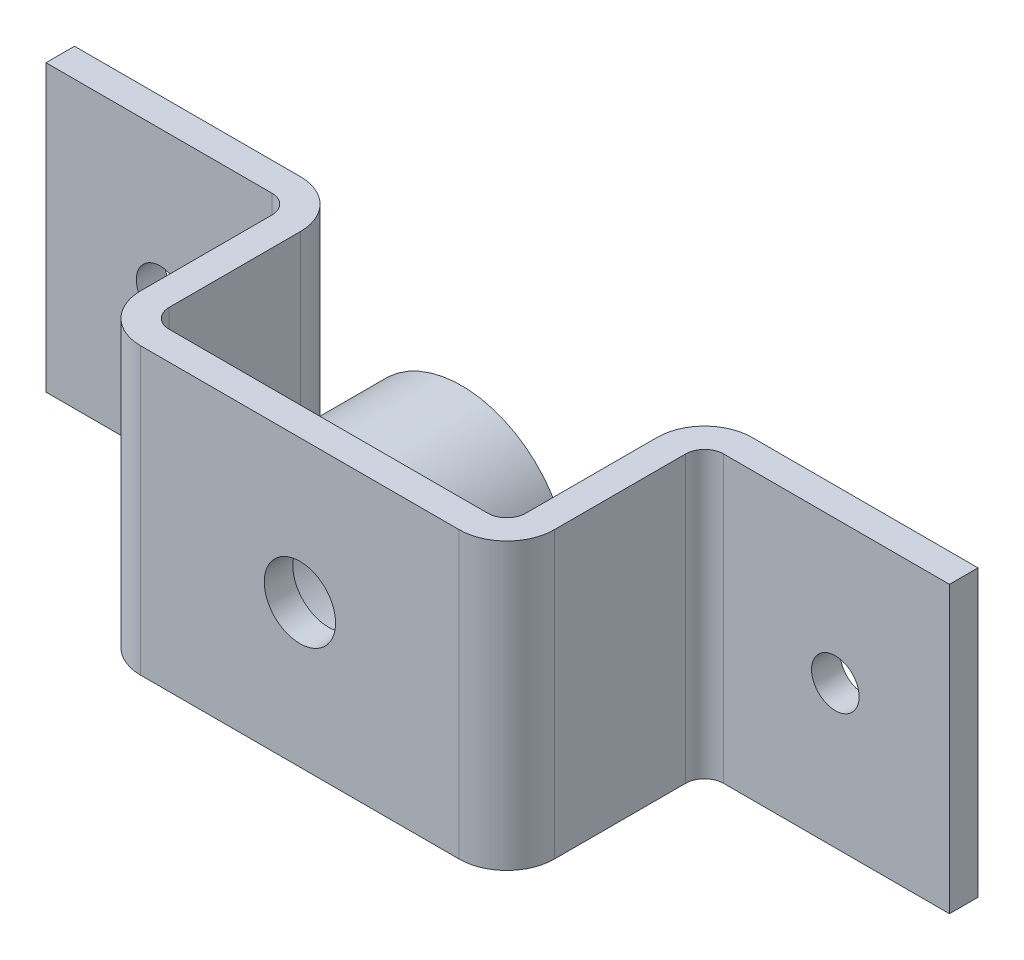
ISO-10303-21;
HEADER;
FILE_DESCRIPTION(('STEP AP214'),'2;1');
FILE_NAME('part.step','',(''),(''),'','','');
FILE_SCHEMA(('AUTOMOTIVE_DESIGN { 1 0 10303 214 1 1 1 1 }'));
ENDSEC;
DATA;
#1=APPLICATION_CONTEXT('core data for automotive mechanical design processes');
#2=APPLICATION_PROTOCOL_DEFINITION('international standard','automotive_design',2000,#1);
#3=PRODUCT_CONTEXT('',#1,'mechanical');
#4=PRODUCT('Part','Part','',(#3));
#5=PRODUCT_RELATED_PRODUCT_CATEGORY('part','',(#4));
#6=PRODUCT_DEFINITION_FORMATION('','',#4);
#7=PRODUCT_DEFINITION_CONTEXT('part definition',#1,'design');
#8=PRODUCT_DEFINITION('design','',#6,#7);
#9=PRODUCT_DEFINITION_SHAPE('','',#8);
#10=(LENGTH_UNIT() NAMED_UNIT(*) SI_UNIT(.MILLI.,.METRE.));
#11=(NAMED_UNIT(*) PLANE_ANGLE_UNIT() SI_UNIT($,.RADIAN.));
#12=(NAMED_UNIT(*) SI_UNIT($,.STERADIAN.) SOLID_ANGLE_UNIT());
#13=UNCERTAINTY_MEASURE_WITH_UNIT(LENGTH_MEASURE(1.E-05),#10,'distance_accuracy_value','');
#14=(GEOMETRIC_REPRESENTATION_CONTEXT(3) GLOBAL_UNCERTAINTY_ASSIGNED_CONTEXT((#13)) GLOBAL_UNIT_ASSIGNED_CONTEXT((#10,
#11,#12)) REPRESENTATION_CONTEXT('',''));
#15=CARTESIAN_POINT('',(0.,0.,0.));
#16=DIRECTION('',(0.,0.,1.));
#17=DIRECTION('',(1.,0.,0.));
#18=AXIS2_PLACEMENT_3D('',#15,#16,#17);
#19=CARTESIAN_POINT('',(-475.,300.,0.));
#20=DIRECTION('',(1.,0.,0.));
#21=DIRECTION('',(0.,0.,-1.));
#22=AXIS2_PLACEMENT_3D('',#19,#20,#21);
#23=PLANE('',#22);
#24=DIRECTION('',(0.,0.,1.));
#25=VECTOR('',#24,1.);
#26=CARTESIAN_POINT('',(-475.,0.,0.));
#27=LINE('',#26,#25);
#28=CARTESIAN_POINT('',(-475.,0.,0.));
#29=VERTEX_POINT('',#28);
#30=CARTESIAN_POINT('',(-475.,0.,30.));
#31=VERTEX_POINT('',#30);
#32=EDGE_CURVE('E207',#29,#31,#27,.T.);
#33=ORIENTED_EDGE('',*,*,#32,.T.);
#34=DIRECTION('',(0.,-1.,0.));
#35=VECTOR('',#34,1.);
#36=CARTESIAN_POINT('',(-475.,300.,30.));
#37=LINE('',#36,#35);
#38=CARTESIAN_POINT('',(-475.,300.,30.));
#39=VERTEX_POINT('',#38);
#40=EDGE_CURVE('E46',#39,#31,#37,.T.);
#41=ORIENTED_EDGE('',*,*,#40,.F.);
#42=DIRECTION('',(0.,0.,1.));
#43=VECTOR('',#42,1.);
#44=CARTESIAN_POINT('',(-475.,300.,0.));
#45=LINE('',#44,#43);
#46=CARTESIAN_POINT('',(-475.,300.,0.));
#47=VERTEX_POINT('',#46);
#48=EDGE_CURVE('E246',#47,#39,#45,.T.);
#49=ORIENTED_EDGE('',*,*,#48,.F.);
#50=DIRECTION('',(0.,-1.,0.));
#51=VECTOR('',#50,1.);
#52=CARTESIAN_POINT('',(-475.,300.,0.));
#53=LINE('',#52,#51);
#54=EDGE_CURVE('E203',#47,#29,#53,.T.);
#55=ORIENTED_EDGE('',*,*,#54,.T.);
#56=EDGE_LOOP('',(#33,#41,#49,#55));
#57=FACE_BOUND('',#56,.T.);
#58=ADVANCED_FACE('F37',(#57),#23,.F.);
#59=CARTESIAN_POINT('',(-475.,300.,30.));
#60=DIRECTION('',(0.,0.,-1.));
#61=DIRECTION('',(-1.,0.,0.));
#62=AXIS2_PLACEMENT_3D('',#59,#60,#61);
#63=PLANE('',#62);
#64=CARTESIAN_POINT('',(-355.,150.,30.));
#65=DIRECTION('',(0.,0.,-1.));
#66=DIRECTION('',(-1.,0.,0.));
#67=AXIS2_PLACEMENT_3D('',#64,#65,#66);
#68=CIRCLE('',#67,25.);
#69=CARTESIAN_POINT('',(-380.,150.,30.));
#70=VERTEX_POINT('',#69);
#71=EDGE_CURVE('E424',#70,#70,#68,.T.);
#72=ORIENTED_EDGE('',*,*,#71,.T.);
#73=EDGE_LOOP('',(#72));
#74=FACE_BOUND('',#73,.T.);
#75=DIRECTION('',(1.,0.,0.));
#76=VECTOR('',#75,1.);
#77=CARTESIAN_POINT('',(-475.,0.,30.));
#78=LINE('',#77,#76);
#79=CARTESIAN_POINT('',(-237.5,0.,30.));
#80=VERTEX_POINT('',#79);
#81=EDGE_CURVE('E210',#31,#80,#78,.T.);
#82=ORIENTED_EDGE('',*,*,#81,.T.);
#83=DIRECTION('',(0.,-1.,0.));
#84=VECTOR('',#83,1.);
#85=CARTESIAN_POINT('',(-237.5,300.,30.));
#86=LINE('',#85,#84);
#87=CARTESIAN_POINT('',(-237.5,300.,30.));
#88=VERTEX_POINT('',#87);
#89=EDGE_CURVE('E292',#88,#80,#86,.T.);
#90=ORIENTED_EDGE('',*,*,#89,.F.);
#91=DIRECTION('',(1.,0.,0.));
#92=VECTOR('',#91,1.);
#93=CARTESIAN_POINT('',(-475.,300.,30.));
#94=LINE('',#93,#92);
#95=EDGE_CURVE('E134',#39,#88,#94,.T.);
#96=ORIENTED_EDGE('',*,*,#95,.F.);
#97=ORIENTED_EDGE('',*,*,#40,.T.);
#98=EDGE_LOOP('',(#82,#90,#96,#97));
#99=FACE_BOUND('',#98,.T.);
#100=ADVANCED_FACE('F296',(#74,#99),#63,.F.);
#101=CARTESIAN_POINT('',(-237.5,300.,50.));
#102=DIRECTION('',(0.,-1.,0.));
#103=DIRECTION('',(0.,0.,-1.));
#104=AXIS2_PLACEMENT_3D('',#101,#102,#103);
#105=CYLINDRICAL_SURFACE('',#104,20.);
#106=CARTESIAN_POINT('',(-237.5,0.,50.));
#107=DIRECTION('',(0.,-1.,0.));
#108=DIRECTION('',(0.,0.,1.));
#109=AXIS2_PLACEMENT_3D('',#106,#107,#108);
#110=CIRCLE('',#109,20.);
#111=CARTESIAN_POINT('',(-217.5,0.,50.0000000000001));
#112=VERTEX_POINT('',#111);
#113=EDGE_CURVE('E213',#80,#112,#110,.T.);
#114=ORIENTED_EDGE('',*,*,#113,.T.);
#115=DIRECTION('',(0.,-1.,0.));
#116=VECTOR('',#115,1.);
#117=CARTESIAN_POINT('',(-217.5,300.,50.0000000000001));
#118=LINE('',#117,#116);
#119=CARTESIAN_POINT('',(-217.5,300.,50.0000000000001));
#120=VERTEX_POINT('',#119);
#121=EDGE_CURVE('E289',#120,#112,#118,.T.);
#122=ORIENTED_EDGE('',*,*,#121,.F.);
#123=CARTESIAN_POINT('',(-237.5,300.,50.));
#124=DIRECTION('',(0.,-1.,0.));
#125=DIRECTION('',(0.,0.,1.));
#126=AXIS2_PLACEMENT_3D('',#123,#124,#125);
#127=CIRCLE('',#126,20.);
#128=EDGE_CURVE('E316',#88,#120,#127,.T.);
#129=ORIENTED_EDGE('',*,*,#128,.F.);
#130=ORIENTED_EDGE('',*,*,#89,.T.);
#131=EDGE_LOOP('',(#114,#122,#129,#130));
#132=FACE_BOUND('',#131,.T.);
#133=ADVANCED_FACE('F307',(#132),#105,.F.);
#134=CARTESIAN_POINT('',(-217.5,300.,188.));
#135=DIRECTION('',(1.,0.,0.));
#136=DIRECTION('',(0.,0.,-1.));
#137=AXIS2_PLACEMENT_3D('',#134,#135,#136);
#138=PLANE('',#137);
#139=DIRECTION('',(0.,0.,1.));
#140=VECTOR('',#139,1.);
#141=CARTESIAN_POINT('',(-217.5,0.,188.));
#142=LINE('',#141,#140);
#143=CARTESIAN_POINT('',(-217.5,0.,188.));
#144=VERTEX_POINT('',#143);
#145=EDGE_CURVE('E215',#112,#144,#142,.T.);
#146=ORIENTED_EDGE('',*,*,#145,.T.);
#147=DIRECTION('',(0.,-1.,0.));
#148=VECTOR('',#147,1.);
#149=CARTESIAN_POINT('',(-217.5,300.,188.));
#150=LINE('',#149,#148);
#151=CARTESIAN_POINT('',(-217.5,300.,188.));
#152=VERTEX_POINT('',#151);
#153=EDGE_CURVE('E286',#152,#144,#150,.T.);
#154=ORIENTED_EDGE('',*,*,#153,.F.);
#155=DIRECTION('',(0.,0.,1.));
#156=VECTOR('',#155,1.);
#157=CARTESIAN_POINT('',(-217.5,300.,188.));
#158=LINE('',#157,#156);
#159=EDGE_CURVE('E313',#120,#152,#158,.T.);
#160=ORIENTED_EDGE('',*,*,#159,.F.);
#161=ORIENTED_EDGE('',*,*,#121,.T.);
#162=EDGE_LOOP('',(#146,#154,#160,#161));
#163=FACE_BOUND('',#162,.T.);
#164=ADVANCED_FACE('F311',(#163),#138,.F.);
#165=CARTESIAN_POINT('',(-167.5,300.,188.));
#166=DIRECTION('',(0.,-1.,0.));
#167=DIRECTION('',(0.,0.,-1.));
#168=AXIS2_PLACEMENT_3D('',#165,#166,#167);
#169=CYLINDRICAL_SURFACE('',#168,50.);
#170=CARTESIAN_POINT('',(-167.5,0.,188.));
#171=DIRECTION('',(0.,1.,0.));
#172=DIRECTION('',(0.,0.,-1.));
#173=AXIS2_PLACEMENT_3D('',#170,#171,#172);
#174=CIRCLE('',#173,50.);
#175=CARTESIAN_POINT('',(-167.5,0.,238.));
#176=VERTEX_POINT('',#175);
#177=EDGE_CURVE('E217',#144,#176,#174,.T.);
#178=ORIENTED_EDGE('',*,*,#177,.T.);
#179=DIRECTION('',(0.,-1.,0.));
#180=VECTOR('',#179,1.);
#181=CARTESIAN_POINT('',(-167.5,300.,238.));
#182=LINE('',#181,#180);
#183=CARTESIAN_POINT('',(-167.5,300.,238.));
#184=VERTEX_POINT('',#183);
#185=EDGE_CURVE('E283',#184,#176,#182,.T.);
#186=ORIENTED_EDGE('',*,*,#185,.F.);
#187=CARTESIAN_POINT('',(-167.5,300.,188.));
#188=DIRECTION('',(0.,1.,0.));
#189=DIRECTION('',(0.,0.,-1.));
#190=AXIS2_PLACEMENT_3D('',#187,#188,#189);
#191=CIRCLE('',#190,50.);
#192=EDGE_CURVE('E315',#152,#184,#191,.T.);
#193=ORIENTED_EDGE('',*,*,#192,.F.);
#194=ORIENTED_EDGE('',*,*,#153,.T.);
#195=EDGE_LOOP('',(#178,#186,#193,#194));
#196=FACE_BOUND('',#195,.T.);
#197=ADVANCED_FACE('F403',(#196),#169,.T.);
#198=CARTESIAN_POINT('',(-167.5,300.,238.));
#199=DIRECTION('',(0.,0.,-1.));
#200=DIRECTION('',(-1.,0.,0.));
#201=AXIS2_PLACEMENT_3D('',#198,#199,#200);
#202=PLANE('',#201);
#203=CARTESIAN_POINT('',(0.,150.,238.));
#204=DIRECTION('',(0.,0.,-1.));
#205=DIRECTION('',(-1.,0.,0.));
#206=AXIS2_PLACEMENT_3D('',#203,#204,#205);
#207=CIRCLE('',#206,37.5);
#208=CARTESIAN_POINT('',(-37.5,150.,238.));
#209=VERTEX_POINT('',#208);
#210=EDGE_CURVE('E40',#209,#209,#207,.T.);
#211=ORIENTED_EDGE('',*,*,#210,.T.);
#212=EDGE_LOOP('',(#211));
#213=FACE_BOUND('',#212,.T.);
#214=DIRECTION('',(1.,0.,0.));
#215=VECTOR('',#214,1.);
#216=CARTESIAN_POINT('',(-167.5,0.,238.));
#217=LINE('',#216,#215);
#218=CARTESIAN_POINT('',(167.5,0.,238.));
#219=VERTEX_POINT('',#218);
#220=EDGE_CURVE('E219',#176,#219,#217,.T.);
#221=ORIENTED_EDGE('',*,*,#220,.T.);
#222=DIRECTION('',(0.,-1.,0.));
#223=VECTOR('',#222,1.);
#224=CARTESIAN_POINT('',(167.5,300.,238.));
#225=LINE('',#224,#223);
#226=CARTESIAN_POINT('',(167.5,300.,238.));
#227=VERTEX_POINT('',#226);
#228=EDGE_CURVE('E280',#227,#219,#225,.T.);
#229=ORIENTED_EDGE('',*,*,#228,.F.);
#230=DIRECTION('',(1.,0.,0.));
#231=VECTOR('',#230,1.);
#232=CARTESIAN_POINT('',(-167.5,300.,238.));
#233=LINE('',#232,#231);
#234=EDGE_CURVE('E318',#184,#227,#233,.T.);
#235=ORIENTED_EDGE('',*,*,#234,.F.);
#236=ORIENTED_EDGE('',*,*,#185,.T.);
#237=EDGE_LOOP('',(#221,#229,#235,#236));
#238=FACE_BOUND('',#237,.T.);
#239=ADVANCED_FACE('F399',(#213,#238),#202,.F.);
#240=CARTESIAN_POINT('',(167.5,300.,188.));
#241=DIRECTION('',(0.,-1.,0.));
#242=DIRECTION('',(0.,0.,-1.));
#243=AXIS2_PLACEMENT_3D('',#240,#241,#242);
#244=CYLINDRICAL_SURFACE('',#243,50.);
#245=CARTESIAN_POINT('',(167.5,0.,188.));
#246=DIRECTION('',(0.,1.,0.));
#247=DIRECTION('',(0.,0.,1.));
#248=AXIS2_PLACEMENT_3D('',#245,#246,#247);
#249=CIRCLE('',#248,50.);
#250=CARTESIAN_POINT('',(217.5,0.,188.));
#251=VERTEX_POINT('',#250);
#252=EDGE_CURVE('E221',#219,#251,#249,.T.);
#253=ORIENTED_EDGE('',*,*,#252,.T.);
#254=DIRECTION('',(0.,-1.,0.));
#255=VECTOR('',#254,1.);
#256=CARTESIAN_POINT('',(217.5,300.,188.));
#257=LINE('',#256,#255);
#258=CARTESIAN_POINT('',(217.5,300.,188.));
#259=VERTEX_POINT('',#258);
#260=EDGE_CURVE('E277',#259,#251,#257,.T.);
#261=ORIENTED_EDGE('',*,*,#260,.F.);
#262=CARTESIAN_POINT('',(167.5,300.,188.));
#263=DIRECTION('',(0.,1.,0.));
#264=DIRECTION('',(0.,0.,1.));
#265=AXIS2_PLACEMENT_3D('',#262,#263,#264);
#266=CIRCLE('',#265,50.);
#267=EDGE_CURVE('E324',#227,#259,#266,.T.);
#268=ORIENTED_EDGE('',*,*,#267,.F.);
#269=ORIENTED_EDGE('',*,*,#228,.T.);
#270=EDGE_LOOP('',(#253,#261,#268,#269));
#271=FACE_BOUND('',#270,.T.);
#272=ADVANCED_FACE('F395',(#271),#244,.T.);
#273=CARTESIAN_POINT('',(217.5,300.,188.));
#274=DIRECTION('',(-1.,0.,0.));
#275=DIRECTION('',(0.,0.,1.));
#276=AXIS2_PLACEMENT_3D('',#273,#274,#275);
#277=PLANE('',#276);
#278=DIRECTION('',(0.,0.,-1.));
#279=VECTOR('',#278,1.);
#280=CARTESIAN_POINT('',(217.5,0.,188.));
#281=LINE('',#280,#279);
#282=CARTESIAN_POINT('',(217.5,0.,50.0000000000003));
#283=VERTEX_POINT('',#282);
#284=EDGE_CURVE('E223',#251,#283,#281,.T.);
#285=ORIENTED_EDGE('',*,*,#284,.T.);
#286=DIRECTION('',(0.,-1.,0.));
#287=VECTOR('',#286,1.);
#288=CARTESIAN_POINT('',(217.5,300.,50.0000000000003));
#289=LINE('',#288,#287);
#290=CARTESIAN_POINT('',(217.5,300.,50.0000000000003));
#291=VERTEX_POINT('',#290);
#292=EDGE_CURVE('E274',#291,#283,#289,.T.);
#293=ORIENTED_EDGE('',*,*,#292,.F.);
#294=DIRECTION('',(0.,0.,-1.));
#295=VECTOR('',#294,1.);
#296=CARTESIAN_POINT('',(217.5,300.,188.));
#297=LINE('',#296,#295);
#298=EDGE_CURVE('E326',#259,#291,#297,.T.);
#299=ORIENTED_EDGE('',*,*,#298,.F.);
#300=ORIENTED_EDGE('',*,*,#260,.T.);
#301=EDGE_LOOP('',(#285,#293,#299,#300));
#302=FACE_BOUND('',#301,.T.);
#303=ADVANCED_FACE('F391',(#302),#277,.F.);
#304=CARTESIAN_POINT('',(237.5,300.,49.9999999999999));
#305=DIRECTION('',(0.,-1.,0.));
#306=DIRECTION('',(0.,0.,-1.));
#307=AXIS2_PLACEMENT_3D('',#304,#305,#306);
#308=CYLINDRICAL_SURFACE('',#307,20.);
#309=CARTESIAN_POINT('',(237.5,0.,49.9999999999999));
#310=DIRECTION('',(0.,-1.,0.));
#311=DIRECTION('',(0.,0.,-1.));
#312=AXIS2_PLACEMENT_3D('',#309,#310,#311);
#313=CIRCLE('',#312,20.);
#314=CARTESIAN_POINT('',(237.5,0.,29.9999999999999));
#315=VERTEX_POINT('',#314);
#316=EDGE_CURVE('E225',#283,#315,#313,.T.);
#317=ORIENTED_EDGE('',*,*,#316,.T.);
#318=DIRECTION('',(0.,-1.,0.));
#319=VECTOR('',#318,1.);
#320=CARTESIAN_POINT('',(237.5,300.,29.9999999999999));
#321=LINE('',#320,#319);
#322=CARTESIAN_POINT('',(237.5,300.,29.9999999999999));
#323=VERTEX_POINT('',#322);
#324=EDGE_CURVE('E271',#323,#315,#321,.T.);
#325=ORIENTED_EDGE('',*,*,#324,.F.);
#326=CARTESIAN_POINT('',(237.5,300.,49.9999999999999));
#327=DIRECTION('',(0.,-1.,0.));
#328=DIRECTION('',(0.,0.,-1.));
#329=AXIS2_PLACEMENT_3D('',#326,#327,#328);
#330=CIRCLE('',#329,20.);
#331=EDGE_CURVE('E328',#291,#323,#330,.T.);
#332=ORIENTED_EDGE('',*,*,#331,.F.);
#333=ORIENTED_EDGE('',*,*,#292,.T.);
#334=EDGE_LOOP('',(#317,#325,#332,#333));
#335=FACE_BOUND('',#334,.T.);
#336=ADVANCED_FACE('F386',(#335),#308,.F.);
#337=CARTESIAN_POINT('',(237.5,300.,29.9999999999999));
#338=DIRECTION('',(0.,0.,-1.));
#339=DIRECTION('',(-1.,0.,0.));
#340=AXIS2_PLACEMENT_3D('',#337,#338,#339);
#341=PLANE('',#340);
#342=CARTESIAN_POINT('',(355.,150.,29.9999999999999));
#343=DIRECTION('',(0.,0.,-1.));
#344=DIRECTION('',(-1.,0.,0.));
#345=AXIS2_PLACEMENT_3D('',#342,#343,#344);
#346=CIRCLE('',#345,25.);
#347=CARTESIAN_POINT('',(330.,150.,29.9999999999999));
#348=VERTEX_POINT('',#347);
#349=EDGE_CURVE('E426',#348,#348,#346,.T.);
#350=ORIENTED_EDGE('',*,*,#349,.T.);
#351=EDGE_LOOP('',(#350));
#352=FACE_BOUND('',#351,.T.);
#353=DIRECTION('',(1.,0.,0.));
#354=VECTOR('',#353,1.);
#355=CARTESIAN_POINT('',(237.5,0.,29.9999999999999));
#356=LINE('',#355,#354);
#357=CARTESIAN_POINT('',(475.,0.,29.9999999999999));
#358=VERTEX_POINT('',#357);
#359=EDGE_CURVE('E227',#315,#358,#356,.T.);
#360=ORIENTED_EDGE('',*,*,#359,.T.);
#361=DIRECTION('',(0.,-1.,0.));
#362=VECTOR('',#361,1.);
#363=CARTESIAN_POINT('',(475.,300.,29.9999999999999));
#364=LINE('',#363,#362);
#365=CARTESIAN_POINT('',(475.,300.,29.9999999999999));
#366=VERTEX_POINT('',#365);
#367=EDGE_CURVE('E268',#366,#358,#364,.T.);
#368=ORIENTED_EDGE('',*,*,#367,.F.);
#369=DIRECTION('',(1.,0.,0.));
#370=VECTOR('',#369,1.);
#371=CARTESIAN_POINT('',(237.5,300.,29.9999999999999));
#372=LINE('',#371,#370);
#373=EDGE_CURVE('E330',#323,#366,#372,.T.);
#374=ORIENTED_EDGE('',*,*,#373,.F.);
#375=ORIENTED_EDGE('',*,*,#324,.T.);
#376=EDGE_LOOP('',(#360,#368,#374,#375));
#377=FACE_BOUND('',#376,.T.);
#378=ADVANCED_FACE('F380',(#352,#377),#341,.F.);
#379=CARTESIAN_POINT('',(475.,300.,-1.16341445918999E-13));
#380=DIRECTION('',(-1.,0.,0.));
#381=DIRECTION('',(0.,0.,1.));
#382=AXIS2_PLACEMENT_3D('',#379,#380,#381);
#383=PLANE('',#382);
#384=DIRECTION('',(0.,0.,-1.));
#385=VECTOR('',#384,1.);
#386=CARTESIAN_POINT('',(475.,0.,-1.16341445918999E-13));
#387=LINE('',#386,#385);
#388=CARTESIAN_POINT('',(475.,0.,-1.16341445918999E-13));
#389=VERTEX_POINT('',#388);
#390=EDGE_CURVE('E229',#358,#389,#387,.T.);
#391=ORIENTED_EDGE('',*,*,#390,.T.);
#392=DIRECTION('',(0.,-1.,0.));
#393=VECTOR('',#392,1.);
#394=CARTESIAN_POINT('',(475.,300.,-1.16341445918999E-13));
#395=LINE('',#394,#393);
#396=CARTESIAN_POINT('',(475.,300.,-1.16341445918999E-13));
#397=VERTEX_POINT('',#396);
#398=EDGE_CURVE('E265',#397,#389,#395,.T.);
#399=ORIENTED_EDGE('',*,*,#398,.F.);
#400=DIRECTION('',(0.,0.,-1.));
#401=VECTOR('',#400,1.);
#402=CARTESIAN_POINT('',(475.,300.,-1.16341445918999E-13));
#403=LINE('',#402,#401);
#404=EDGE_CURVE('E332',#366,#397,#403,.T.);
#405=ORIENTED_EDGE('',*,*,#404,.F.);
#406=ORIENTED_EDGE('',*,*,#367,.T.);
#407=EDGE_LOOP('',(#391,#399,#405,#406));
#408=FACE_BOUND('',#407,.T.);
#409=ADVANCED_FACE('F376',(#408),#383,.F.);
#410=CARTESIAN_POINT('',(237.5,300.,0.));
#411=DIRECTION('',(0.,0.,1.));
#412=DIRECTION('',(1.,0.,0.));
#413=AXIS2_PLACEMENT_3D('',#410,#411,#412);
#414=PLANE('',#413);
#415=CARTESIAN_POINT('',(355.,150.,0.));
#416=DIRECTION('',(0.,0.,-1.));
#417=DIRECTION('',(-1.,0.,0.));
#418=AXIS2_PLACEMENT_3D('',#415,#416,#417);
#419=CIRCLE('',#418,25.);
#420=CARTESIAN_POINT('',(330.,150.,0.));
#421=VERTEX_POINT('',#420);
#422=EDGE_CURVE('E427',#421,#421,#419,.T.);
#423=ORIENTED_EDGE('',*,*,#422,.F.);
#424=EDGE_LOOP('',(#423));
#425=FACE_BOUND('',#424,.T.);
#426=DIRECTION('',(-1.,0.,0.));
#427=VECTOR('',#426,1.);
#428=CARTESIAN_POINT('',(237.5,0.,0.));
#429=LINE('',#428,#427);
#430=CARTESIAN_POINT('',(237.5,0.,0.));
#431=VERTEX_POINT('',#430);
#432=EDGE_CURVE('E231',#389,#431,#429,.T.);
#433=ORIENTED_EDGE('',*,*,#432,.T.);
#434=DIRECTION('',(0.,-1.,0.));
#435=VECTOR('',#434,1.);
#436=CARTESIAN_POINT('',(237.5,300.,0.));
#437=LINE('',#436,#435);
#438=CARTESIAN_POINT('',(237.5,300.,0.));
#439=VERTEX_POINT('',#438);
#440=EDGE_CURVE('E262',#439,#431,#437,.T.);
#441=ORIENTED_EDGE('',*,*,#440,.F.);
#442=DIRECTION('',(-1.,0.,0.));
#443=VECTOR('',#442,1.);
#444=CARTESIAN_POINT('',(237.5,300.,0.));
#445=LINE('',#444,#443);
#446=EDGE_CURVE('E334',#397,#439,#445,.T.);
#447=ORIENTED_EDGE('',*,*,#446,.F.);
#448=ORIENTED_EDGE('',*,*,#398,.T.);
#449=EDGE_LOOP('',(#433,#441,#447,#448));
#450=FACE_BOUND('',#449,.T.);
#451=ADVANCED_FACE('F371',(#425,#450),#414,.F.);
#452=CARTESIAN_POINT('',(237.5,300.,49.9999999999999));
#453=DIRECTION('',(0.,-1.,0.));
#454=DIRECTION('',(0.,0.,-1.));
#455=AXIS2_PLACEMENT_3D('',#452,#453,#454);
#456=CYLINDRICAL_SURFACE('',#455,50.);
#457=CARTESIAN_POINT('',(237.5,0.,49.9999999999999));
#458=DIRECTION('',(0.,1.,0.));
#459=DIRECTION('',(0.,0.,-1.));
#460=AXIS2_PLACEMENT_3D('',#457,#458,#459);
#461=CIRCLE('',#460,50.);
#462=CARTESIAN_POINT('',(187.5,0.,50.0000000000003));
#463=VERTEX_POINT('',#462);
#464=EDGE_CURVE('E233',#431,#463,#461,.T.);
#465=ORIENTED_EDGE('',*,*,#464,.T.);
#466=DIRECTION('',(0.,-1.,0.));
#467=VECTOR('',#466,1.);
#468=CARTESIAN_POINT('',(187.5,300.,50.0000000000003));
#469=LINE('',#468,#467);
#470=CARTESIAN_POINT('',(187.5,300.,50.0000000000003));
#471=VERTEX_POINT('',#470);
#472=EDGE_CURVE('E259',#471,#463,#469,.T.);
#473=ORIENTED_EDGE('',*,*,#472,.F.);
#474=CARTESIAN_POINT('',(237.5,300.,49.9999999999999));
#475=DIRECTION('',(0.,1.,0.));
#476=DIRECTION('',(0.,0.,-1.));
#477=AXIS2_PLACEMENT_3D('',#474,#475,#476);
#478=CIRCLE('',#477,50.);
#479=EDGE_CURVE('E336',#439,#471,#478,.T.);
#480=ORIENTED_EDGE('',*,*,#479,.F.);
#481=ORIENTED_EDGE('',*,*,#440,.T.);
#482=EDGE_LOOP('',(#465,#473,#480,#481));
#483=FACE_BOUND('',#482,.T.);
#484=ADVANCED_FACE('F365',(#483),#456,.T.);
#485=CARTESIAN_POINT('',(187.5,300.,188.));
#486=DIRECTION('',(1.,0.,0.));
#487=DIRECTION('',(0.,0.,-1.));
#488=AXIS2_PLACEMENT_3D('',#485,#486,#487);
#489=PLANE('',#488);
#490=DIRECTION('',(0.,0.,1.));
#491=VECTOR('',#490,1.);
#492=CARTESIAN_POINT('',(187.5,0.,188.));
#493=LINE('',#492,#491);
#494=CARTESIAN_POINT('',(187.5,0.,188.));
#495=VERTEX_POINT('',#494);
#496=EDGE_CURVE('E235',#463,#495,#493,.T.);
#497=ORIENTED_EDGE('',*,*,#496,.T.);
#498=DIRECTION('',(0.,-1.,0.));
#499=VECTOR('',#498,1.);
#500=CARTESIAN_POINT('',(187.5,300.,188.));
#501=LINE('',#500,#499);
#502=CARTESIAN_POINT('',(187.5,300.,188.));
#503=VERTEX_POINT('',#502);
#504=EDGE_CURVE('E256',#503,#495,#501,.T.);
#505=ORIENTED_EDGE('',*,*,#504,.F.);
#506=DIRECTION('',(0.,0.,1.));
#507=VECTOR('',#506,1.);
#508=CARTESIAN_POINT('',(187.5,300.,188.));
#509=LINE('',#508,#507);
#510=EDGE_CURVE('E338',#471,#503,#509,.T.);
#511=ORIENTED_EDGE('',*,*,#510,.F.);
#512=ORIENTED_EDGE('',*,*,#472,.T.);
#513=EDGE_LOOP('',(#497,#505,#511,#512));
#514=FACE_BOUND('',#513,.T.);
#515=ADVANCED_FACE('F361',(#514),#489,.F.);
#516=CARTESIAN_POINT('',(167.5,300.,188.));
#517=DIRECTION('',(0.,-1.,0.));
#518=DIRECTION('',(0.,0.,-1.));
#519=AXIS2_PLACEMENT_3D('',#516,#517,#518);
#520=CYLINDRICAL_SURFACE('',#519,20.);
#521=CARTESIAN_POINT('',(167.5,0.,188.));
#522=DIRECTION('',(0.,-1.,0.));
#523=DIRECTION('',(0.,0.,1.));
#524=AXIS2_PLACEMENT_3D('',#521,#522,#523);
#525=CIRCLE('',#524,20.);
#526=CARTESIAN_POINT('',(167.5,0.,208.));
#527=VERTEX_POINT('',#526);
#528=EDGE_CURVE('E237',#495,#527,#525,.T.);
#529=ORIENTED_EDGE('',*,*,#528,.T.);
#530=DIRECTION('',(0.,-1.,0.));
#531=VECTOR('',#530,1.);
#532=CARTESIAN_POINT('',(167.5,300.,208.));
#533=LINE('',#532,#531);
#534=CARTESIAN_POINT('',(167.5,300.,208.));
#535=VERTEX_POINT('',#534);
#536=EDGE_CURVE('E253',#535,#527,#533,.T.);
#537=ORIENTED_EDGE('',*,*,#536,.F.);
#538=CARTESIAN_POINT('',(167.5,300.,188.));
#539=DIRECTION('',(0.,-1.,0.));
#540=DIRECTION('',(0.,0.,1.));
#541=AXIS2_PLACEMENT_3D('',#538,#539,#540);
#542=CIRCLE('',#541,20.);
#543=EDGE_CURVE('E340',#503,#535,#542,.T.);
#544=ORIENTED_EDGE('',*,*,#543,.F.);
#545=ORIENTED_EDGE('',*,*,#504,.T.);
#546=EDGE_LOOP('',(#529,#537,#544,#545));
#547=FACE_BOUND('',#546,.T.);
#548=ADVANCED_FACE('F357',(#547),#520,.F.);
#549=CARTESIAN_POINT('',(-167.5,300.,208.));
#550=DIRECTION('',(0.,0.,1.));
#551=DIRECTION('',(1.,0.,0.));
#552=AXIS2_PLACEMENT_3D('',#549,#550,#551);
#553=PLANE('',#552);
#554=CARTESIAN_POINT('',(0.,150.,208.));
#555=DIRECTION('',(0.,0.,1.));
#556=DIRECTION('',(1.,0.,0.));
#557=AXIS2_PLACEMENT_3D('',#554,#555,#556);
#558=CIRCLE('',#557,112.5);
#559=CARTESIAN_POINT('',(112.5,150.,208.));
#560=VERTEX_POINT('',#559);
#561=EDGE_CURVE('E11',#560,#560,#558,.F.);
#562=ORIENTED_EDGE('',*,*,#561,.F.);
#563=EDGE_LOOP('',(#562));
#564=FACE_BOUND('',#563,.T.);
#565=DIRECTION('',(-1.,0.,0.));
#566=VECTOR('',#565,1.);
#567=CARTESIAN_POINT('',(-167.5,0.,208.));
#568=LINE('',#567,#566);
#569=CARTESIAN_POINT('',(-167.5,0.,208.));
#570=VERTEX_POINT('',#569);
#571=EDGE_CURVE('E239',#527,#570,#568,.T.);
#572=ORIENTED_EDGE('',*,*,#571,.T.);
#573=DIRECTION('',(0.,-1.,0.));
#574=VECTOR('',#573,1.);
#575=CARTESIAN_POINT('',(-167.5,300.,208.));
#576=LINE('',#575,#574);
#577=CARTESIAN_POINT('',(-167.5,300.,208.));
#578=VERTEX_POINT('',#577);
#579=EDGE_CURVE('E250',#578,#570,#576,.T.);
#580=ORIENTED_EDGE('',*,*,#579,.F.);
#581=DIRECTION('',(-1.,0.,0.));
#582=VECTOR('',#581,1.);
#583=CARTESIAN_POINT('',(-167.5,300.,208.));
#584=LINE('',#583,#582);
#585=EDGE_CURVE('E342',#535,#578,#584,.T.);
#586=ORIENTED_EDGE('',*,*,#585,.F.);
#587=ORIENTED_EDGE('',*,*,#536,.T.);
#588=EDGE_LOOP('',(#572,#580,#586,#587));
#589=FACE_BOUND('',#588,.T.);
#590=ADVANCED_FACE('F348',(#564,#589),#553,.F.);
#591=CARTESIAN_POINT('',(-167.5,300.,188.));
#592=DIRECTION('',(0.,-1.,0.));
#593=DIRECTION('',(0.,0.,-1.));
#594=AXIS2_PLACEMENT_3D('',#591,#592,#593);
#595=CYLINDRICAL_SURFACE('',#594,20.);
#596=CARTESIAN_POINT('',(-167.5,0.,188.));
#597=DIRECTION('',(0.,-1.,0.));
#598=DIRECTION('',(0.,0.,-1.));
#599=AXIS2_PLACEMENT_3D('',#596,#597,#598);
#600=CIRCLE('',#599,20.);
#601=CARTESIAN_POINT('',(-187.5,0.,188.));
#602=VERTEX_POINT('',#601);
#603=EDGE_CURVE('E241',#570,#602,#600,.T.);
#604=ORIENTED_EDGE('',*,*,#603,.T.);
#605=DIRECTION('',(0.,-1.,0.));
#606=VECTOR('',#605,1.);
#607=CARTESIAN_POINT('',(-187.5,300.,188.));
#608=LINE('',#607,#606);
#609=CARTESIAN_POINT('',(-187.5,300.,188.));
#610=VERTEX_POINT('',#609);
#611=EDGE_CURVE('E198',#610,#602,#608,.T.);
#612=ORIENTED_EDGE('',*,*,#611,.F.);
#613=CARTESIAN_POINT('',(-167.5,300.,188.));
#614=DIRECTION('',(0.,-1.,0.));
#615=DIRECTION('',(0.,0.,-1.));
#616=AXIS2_PLACEMENT_3D('',#613,#614,#615);
#617=CIRCLE('',#616,20.);
#618=EDGE_CURVE('E189',#578,#610,#617,.T.);
#619=ORIENTED_EDGE('',*,*,#618,.F.);
#620=ORIENTED_EDGE('',*,*,#579,.T.);
#621=EDGE_LOOP('',(#604,#612,#619,#620));
#622=FACE_BOUND('',#621,.T.);
#623=ADVANCED_FACE('F352',(#622),#595,.F.);
#624=CARTESIAN_POINT('',(-187.5,300.,188.));
#625=DIRECTION('',(-1.,0.,0.));
#626=DIRECTION('',(0.,0.,1.));
#627=AXIS2_PLACEMENT_3D('',#624,#625,#626);
#628=PLANE('',#627);
#629=DIRECTION('',(0.,0.,-1.));
#630=VECTOR('',#629,1.);
#631=CARTESIAN_POINT('',(-187.5,0.,188.));
#632=LINE('',#631,#630);
#633=CARTESIAN_POINT('',(-187.5,0.,50.0000000000003));
#634=VERTEX_POINT('',#633);
#635=EDGE_CURVE('E197',#602,#634,#632,.T.);
#636=ORIENTED_EDGE('',*,*,#635,.T.);
#637=DIRECTION('',(0.,-1.,0.));
#638=VECTOR('',#637,1.);
#639=CARTESIAN_POINT('',(-187.5,300.,50.0000000000003));
#640=LINE('',#639,#638);
#641=CARTESIAN_POINT('',(-187.5,300.,50.0000000000003));
#642=VERTEX_POINT('',#641);
#643=EDGE_CURVE('E194',#642,#634,#640,.T.);
#644=ORIENTED_EDGE('',*,*,#643,.F.);
#645=DIRECTION('',(0.,0.,-1.));
#646=VECTOR('',#645,1.);
#647=CARTESIAN_POINT('',(-187.5,300.,188.));
#648=LINE('',#647,#646);
#649=EDGE_CURVE('E183',#610,#642,#648,.T.);
#650=ORIENTED_EDGE('',*,*,#649,.F.);
#651=ORIENTED_EDGE('',*,*,#611,.T.);
#652=EDGE_LOOP('',(#636,#644,#650,#651));
#653=FACE_BOUND('',#652,.T.);
#654=ADVANCED_FACE('F195',(#653),#628,.F.);
#655=CARTESIAN_POINT('',(-237.5,300.,50.));
#656=DIRECTION('',(0.,-1.,0.));
#657=DIRECTION('',(0.,0.,-1.));
#658=AXIS2_PLACEMENT_3D('',#655,#656,#657);
#659=CYLINDRICAL_SURFACE('',#658,50.);
#660=CARTESIAN_POINT('',(-237.5,0.,50.));
#661=DIRECTION('',(0.,1.,0.));
#662=DIRECTION('',(0.,0.,1.));
#663=AXIS2_PLACEMENT_3D('',#660,#661,#662);
#664=CIRCLE('',#663,50.);
#665=CARTESIAN_POINT('',(-237.5,0.,0.));
#666=VERTEX_POINT('',#665);
#667=EDGE_CURVE('E119',#634,#666,#664,.T.);
#668=ORIENTED_EDGE('',*,*,#667,.T.);
#669=DIRECTION('',(0.,-1.,0.));
#670=VECTOR('',#669,1.);
#671=CARTESIAN_POINT('',(-237.5,300.,0.));
#672=LINE('',#671,#670);
#673=CARTESIAN_POINT('',(-237.5,300.,0.));
#674=VERTEX_POINT('',#673);
#675=EDGE_CURVE('E199',#674,#666,#672,.T.);
#676=ORIENTED_EDGE('',*,*,#675,.F.);
#677=CARTESIAN_POINT('',(-237.5,300.,50.));
#678=DIRECTION('',(0.,1.,0.));
#679=DIRECTION('',(0.,0.,1.));
#680=AXIS2_PLACEMENT_3D('',#677,#678,#679);
#681=CIRCLE('',#680,50.);
#682=EDGE_CURVE('E187',#642,#674,#681,.T.);
#683=ORIENTED_EDGE('',*,*,#682,.F.);
#684=ORIENTED_EDGE('',*,*,#643,.T.);
#685=EDGE_LOOP('',(#668,#676,#683,#684));
#686=FACE_BOUND('',#685,.T.);
#687=ADVANCED_FACE('F201',(#686),#659,.T.);
#688=CARTESIAN_POINT('',(-475.,300.,0.));
#689=DIRECTION('',(0.,0.,1.));
#690=DIRECTION('',(1.,0.,0.));
#691=AXIS2_PLACEMENT_3D('',#688,#689,#690);
#692=PLANE('',#691);
#693=CARTESIAN_POINT('',(-355.,150.,0.));
#694=DIRECTION('',(0.,0.,-1.));
#695=DIRECTION('',(1.,0.,0.));
#696=AXIS2_PLACEMENT_3D('',#693,#694,#695);
#697=CIRCLE('',#696,25.);
#698=CARTESIAN_POINT('',(-330.,150.,0.));
#699=VERTEX_POINT('',#698);
#700=EDGE_CURVE('E433',#699,#699,#697,.T.);
#701=ORIENTED_EDGE('',*,*,#700,.F.);
#702=EDGE_LOOP('',(#701));
#703=FACE_BOUND('',#702,.T.);
#704=DIRECTION('',(-1.,0.,0.));
#705=VECTOR('',#704,1.);
#706=CARTESIAN_POINT('',(-475.,0.,0.));
#707=LINE('',#706,#705);
#708=EDGE_CURVE('E125',#666,#29,#707,.T.);
#709=ORIENTED_EDGE('',*,*,#708,.T.);
#710=ORIENTED_EDGE('',*,*,#54,.F.);
#711=DIRECTION('',(-1.,0.,0.));
#712=VECTOR('',#711,1.);
#713=CARTESIAN_POINT('',(-475.,300.,0.));
#714=LINE('',#713,#712);
#715=EDGE_CURVE('E54',#674,#47,#714,.T.);
#716=ORIENTED_EDGE('',*,*,#715,.F.);
#717=ORIENTED_EDGE('',*,*,#675,.T.);
#718=EDGE_LOOP('',(#709,#710,#716,#717));
#719=FACE_BOUND('',#718,.T.);
#720=ADVANCED_FACE('F547',(#703,#719),#692,.F.);
#721=CARTESIAN_POINT('',(-237.5,300.,50.));
#722=DIRECTION('',(0.,1.,0.));
#723=DIRECTION('',(0.,0.,1.));
#724=AXIS2_PLACEMENT_3D('',#721,#722,#723);
#725=PLANE('',#724);
#726=ORIENTED_EDGE('',*,*,#48,.T.);
#727=ORIENTED_EDGE('',*,*,#95,.T.);
#728=ORIENTED_EDGE('',*,*,#128,.T.);
#729=ORIENTED_EDGE('',*,*,#159,.T.);
#730=ORIENTED_EDGE('',*,*,#192,.T.);
#731=ORIENTED_EDGE('',*,*,#234,.T.);
#732=ORIENTED_EDGE('',*,*,#267,.T.);
#733=ORIENTED_EDGE('',*,*,#298,.T.);
#734=ORIENTED_EDGE('',*,*,#331,.T.);
#735=ORIENTED_EDGE('',*,*,#373,.T.);
#736=ORIENTED_EDGE('',*,*,#404,.T.);
#737=ORIENTED_EDGE('',*,*,#446,.T.);
#738=ORIENTED_EDGE('',*,*,#479,.T.);
#739=ORIENTED_EDGE('',*,*,#510,.T.);
#740=ORIENTED_EDGE('',*,*,#543,.T.);
#741=ORIENTED_EDGE('',*,*,#585,.T.);
#742=ORIENTED_EDGE('',*,*,#618,.T.);
#743=ORIENTED_EDGE('',*,*,#649,.T.);
#744=ORIENTED_EDGE('',*,*,#682,.T.);
#745=ORIENTED_EDGE('',*,*,#715,.T.);
#746=EDGE_LOOP('',(#726,#727,#728,#729,#730,#731,#732,#733,#734,#735,#736,#737,#738,#739,#740,
#741,#742,#743,#744,#745));
#747=FACE_BOUND('',#746,.T.);
#748=ADVANCED_FACE('F185',(#747),#725,.T.);
#749=CARTESIAN_POINT('',(-237.5,0.,50.));
#750=DIRECTION('',(0.,1.,0.));
#751=DIRECTION('',(0.,0.,1.));
#752=AXIS2_PLACEMENT_3D('',#749,#750,#751);
#753=PLANE('',#752);
#754=ORIENTED_EDGE('',*,*,#32,.F.);
#755=ORIENTED_EDGE('',*,*,#708,.F.);
#756=ORIENTED_EDGE('',*,*,#667,.F.);
#757=ORIENTED_EDGE('',*,*,#635,.F.);
#758=ORIENTED_EDGE('',*,*,#603,.F.);
#759=ORIENTED_EDGE('',*,*,#571,.F.);
#760=ORIENTED_EDGE('',*,*,#528,.F.);
#761=ORIENTED_EDGE('',*,*,#496,.F.);
#762=ORIENTED_EDGE('',*,*,#464,.F.);
#763=ORIENTED_EDGE('',*,*,#432,.F.);
#764=ORIENTED_EDGE('',*,*,#390,.F.);
#765=ORIENTED_EDGE('',*,*,#359,.F.);
#766=ORIENTED_EDGE('',*,*,#316,.F.);
#767=ORIENTED_EDGE('',*,*,#284,.F.);
#768=ORIENTED_EDGE('',*,*,#252,.F.);
#769=ORIENTED_EDGE('',*,*,#220,.F.);
#770=ORIENTED_EDGE('',*,*,#177,.F.);
#771=ORIENTED_EDGE('',*,*,#145,.F.);
#772=ORIENTED_EDGE('',*,*,#113,.F.);
#773=ORIENTED_EDGE('',*,*,#81,.F.);
#774=EDGE_LOOP('',(#754,#755,#756,#757,#758,#759,#760,#761,#762,#763,#764,#765,#766,#767,#768,
#769,#770,#771,#772,#773));
#775=FACE_BOUND('',#774,.T.);
#776=ADVANCED_FACE('F301',(#775),#753,.F.);
#777=CARTESIAN_POINT('',(0.,150.,68.));
#778=DIRECTION('',(0.,0.,1.));
#779=DIRECTION('',(1.,0.,0.));
#780=AXIS2_PLACEMENT_3D('',#777,#778,#779);
#781=CYLINDRICAL_SURFACE('',#780,112.5);
#782=CARTESIAN_POINT('',(0.,150.,68.));
#783=DIRECTION('',(0.,0.,-1.));
#784=DIRECTION('',(-1.,0.,0.));
#785=AXIS2_PLACEMENT_3D('',#782,#783,#784);
#786=CIRCLE('',#785,112.5);
#787=CARTESIAN_POINT('',(-112.5,150.,68.));
#788=VERTEX_POINT('',#787);
#789=EDGE_CURVE('E211',#788,#788,#786,.T.);
#790=ORIENTED_EDGE('',*,*,#789,.F.);
#791=EDGE_LOOP('',(#790));
#792=FACE_BOUND('',#791,.T.);
#793=ORIENTED_EDGE('',*,*,#561,.T.);
#794=EDGE_LOOP('',(#793));
#795=FACE_BOUND('',#794,.T.);
#796=ADVANCED_FACE('F451',(#792,#795),#781,.T.);
#797=CARTESIAN_POINT('',(0.,150.,68.));
#798=DIRECTION('',(0.,0.,-1.));
#799=DIRECTION('',(-1.,0.,0.));
#800=AXIS2_PLACEMENT_3D('',#797,#798,#799);
#801=PLANE('',#800);
#802=CARTESIAN_POINT('',(0.,150.,68.));
#803=DIRECTION('',(0.,0.,-1.));
#804=DIRECTION('',(-1.,0.,0.));
#805=AXIS2_PLACEMENT_3D('',#802,#803,#804);
#806=CIRCLE('',#805,87.5);
#807=CARTESIAN_POINT('',(-87.5,150.,68.));
#808=VERTEX_POINT('',#807);
#809=EDGE_CURVE('E442',#808,#808,#806,.T.);
#810=ORIENTED_EDGE('',*,*,#809,.F.);
#811=EDGE_LOOP('',(#810));
#812=FACE_BOUND('',#811,.T.);
#813=ORIENTED_EDGE('',*,*,#789,.T.);
#814=EDGE_LOOP('',(#813));
#815=FACE_BOUND('',#814,.T.);
#816=ADVANCED_FACE('F449',(#812,#815),#801,.T.);
#817=CARTESIAN_POINT('',(0.,150.,208.));
#818=DIRECTION('',(0.,0.,-1.));
#819=DIRECTION('',(-1.,0.,0.));
#820=AXIS2_PLACEMENT_3D('',#817,#818,#819);
#821=CYLINDRICAL_SURFACE('',#820,87.5);
#822=CARTESIAN_POINT('',(0.,150.,208.));
#823=DIRECTION('',(0.,0.,-1.));
#824=DIRECTION('',(-1.,0.,0.));
#825=AXIS2_PLACEMENT_3D('',#822,#823,#824);
#826=CIRCLE('',#825,87.5);
#827=CARTESIAN_POINT('',(-87.5,150.,208.));
#828=VERTEX_POINT('',#827);
#829=EDGE_CURVE('E439',#828,#828,#826,.T.);
#830=ORIENTED_EDGE('',*,*,#829,.F.);
#831=EDGE_LOOP('',(#830));
#832=FACE_BOUND('',#831,.T.);
#833=ORIENTED_EDGE('',*,*,#809,.T.);
#834=EDGE_LOOP('',(#833));
#835=FACE_BOUND('',#834,.T.);
#836=ADVANCED_FACE('F588',(#832,#835),#821,.F.);
#837=CARTESIAN_POINT('',(0.,150.,208.));
#838=DIRECTION('',(0.,0.,-1.));
#839=DIRECTION('',(-1.,0.,0.));
#840=AXIS2_PLACEMENT_3D('',#837,#838,#839);
#841=PLANE('',#840);
#842=CARTESIAN_POINT('',(0.,150.,208.));
#843=DIRECTION('',(0.,0.,-1.));
#844=DIRECTION('',(-1.,0.,0.));
#845=AXIS2_PLACEMENT_3D('',#842,#843,#844);
#846=CIRCLE('',#845,37.5);
#847=CARTESIAN_POINT('',(-37.5,150.,208.));
#848=VERTEX_POINT('',#847);
#849=EDGE_CURVE('E430',#848,#848,#846,.T.);
#850=ORIENTED_EDGE('',*,*,#849,.F.);
#851=EDGE_LOOP('',(#850));
#852=FACE_BOUND('',#851,.T.);
#853=ORIENTED_EDGE('',*,*,#829,.T.);
#854=EDGE_LOOP('',(#853));
#855=FACE_BOUND('',#854,.T.);
#856=ADVANCED_FACE('F598',(#852,#855),#841,.T.);
#857=CARTESIAN_POINT('',(0.,150.,348.));
#858=DIRECTION('',(0.,0.,-1.));
#859=DIRECTION('',(-1.,0.,0.));
#860=AXIS2_PLACEMENT_3D('',#857,#858,#859);
#861=CYLINDRICAL_SURFACE('',#860,37.5);
#862=ORIENTED_EDGE('',*,*,#849,.T.);
#863=EDGE_LOOP('',(#862));
#864=FACE_BOUND('',#863,.T.);
#865=ORIENTED_EDGE('',*,*,#210,.F.);
#866=EDGE_LOOP('',(#865));
#867=FACE_BOUND('',#866,.T.);
#868=ADVANCED_FACE('F616',(#864,#867),#861,.F.);
#869=CARTESIAN_POINT('',(-355.,150.,140.));
#870=DIRECTION('',(0.,0.,-1.));
#871=DIRECTION('',(-1.,0.,0.));
#872=AXIS2_PLACEMENT_3D('',#869,#870,#871);
#873=CYLINDRICAL_SURFACE('',#872,25.);
#874=ORIENTED_EDGE('',*,*,#700,.T.);
#875=EDGE_LOOP('',(#874));
#876=FACE_BOUND('',#875,.T.);
#877=ORIENTED_EDGE('',*,*,#71,.F.);
#878=EDGE_LOOP('',(#877));
#879=FACE_BOUND('',#878,.T.);
#880=ADVANCED_FACE('F626',(#876,#879),#873,.F.);
#881=CARTESIAN_POINT('',(355.,150.,140.));
#882=DIRECTION('',(0.,0.,-1.));
#883=DIRECTION('',(-1.,0.,0.));
#884=AXIS2_PLACEMENT_3D('',#881,#882,#883);
#885=CYLINDRICAL_SURFACE('',#884,25.);
#886=ORIENTED_EDGE('',*,*,#422,.T.);
#887=EDGE_LOOP('',(#886));
#888=FACE_BOUND('',#887,.T.);
#889=ORIENTED_EDGE('',*,*,#349,.F.);
#890=EDGE_LOOP('',(#889));
#891=FACE_BOUND('',#890,.T.);
#892=ADVANCED_FACE('F718',(#888,#891),#885,.F.);
#893=CLOSED_SHELL('',(#58,#100,#133,#164,#197,#239,#272,#303,#336,#378,#409,#451,#484,#515,#548,
#590,#623,#654,#687,#720,#748,#776,#796,#816,#836,#856,#868,#880,#892));
#894=MANIFOLD_SOLID_BREP('B2',#893);
#895=ADVANCED_BREP_SHAPE_REPRESENTATION('',(#18,#894),#14);
#896=SHAPE_DEFINITION_REPRESENTATION(#9,#895);
ENDSEC;
END-ISO-10303-21;
